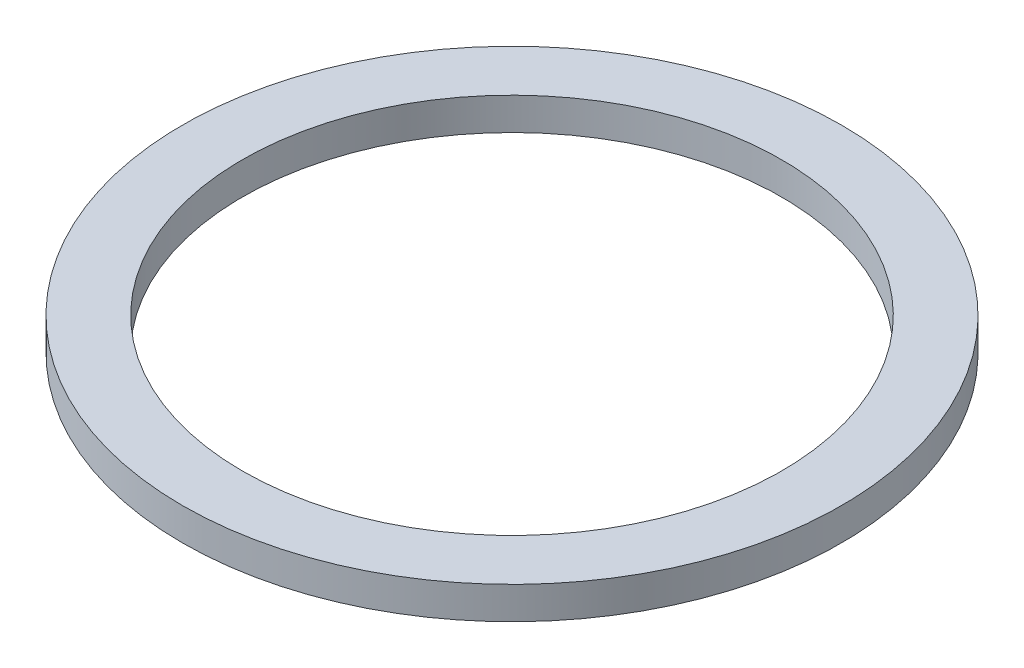
ISO-10303-21;
HEADER;
FILE_DESCRIPTION(('STEP AP214'),'2;1');
FILE_NAME('part.step','',(''),(''),'','','');
FILE_SCHEMA(('AUTOMOTIVE_DESIGN { 1 0 10303 214 1 1 1 1 }'));
ENDSEC;
DATA;
#1=APPLICATION_CONTEXT('core data for automotive mechanical design processes');
#2=APPLICATION_PROTOCOL_DEFINITION('international standard','automotive_design',2000,#1);
#3=PRODUCT_CONTEXT('',#1,'mechanical');
#4=PRODUCT('Part','Part','',(#3));
#5=PRODUCT_RELATED_PRODUCT_CATEGORY('part','',(#4));
#6=PRODUCT_DEFINITION_FORMATION('','',#4);
#7=PRODUCT_DEFINITION_CONTEXT('part definition',#1,'design');
#8=PRODUCT_DEFINITION('design','',#6,#7);
#9=PRODUCT_DEFINITION_SHAPE('','',#8);
#10=(LENGTH_UNIT() NAMED_UNIT(*) SI_UNIT(.MILLI.,.METRE.));
#11=(NAMED_UNIT(*) PLANE_ANGLE_UNIT() SI_UNIT($,.RADIAN.));
#12=(NAMED_UNIT(*) SI_UNIT($,.STERADIAN.) SOLID_ANGLE_UNIT());
#13=UNCERTAINTY_MEASURE_WITH_UNIT(LENGTH_MEASURE(1.E-05),#10,'distance_accuracy_value','');
#14=(GEOMETRIC_REPRESENTATION_CONTEXT(3) GLOBAL_UNCERTAINTY_ASSIGNED_CONTEXT((#13)) GLOBAL_UNIT_ASSIGNED_CONTEXT((#10,
#11,#12)) REPRESENTATION_CONTEXT('',''));
#15=CARTESIAN_POINT('',(0.,0.,0.));
#16=DIRECTION('',(0.,0.,1.));
#17=DIRECTION('',(1.,0.,0.));
#18=AXIS2_PLACEMENT_3D('',#15,#16,#17);
#19=CARTESIAN_POINT('',(0.,1.62,0.));
#20=DIRECTION('',(0.,-1.,0.));
#21=DIRECTION('',(0.,0.,-1.));
#22=AXIS2_PLACEMENT_3D('',#19,#20,#21);
#23=CYLINDRICAL_SURFACE('',#22,16.5);
#24=CARTESIAN_POINT('',(0.,1.62,0.));
#25=DIRECTION('',(0.,1.,0.));
#26=DIRECTION('',(0.,0.,1.));
#27=AXIS2_PLACEMENT_3D('',#24,#25,#26);
#28=CIRCLE('',#27,16.5);
#29=CARTESIAN_POINT('',(0.,1.62,16.5));
#30=VERTEX_POINT('',#29);
#31=EDGE_CURVE('E10',#30,#30,#28,.T.);
#32=ORIENTED_EDGE('',*,*,#31,.F.);
#33=EDGE_LOOP('',(#32));
#34=FACE_BOUND('',#33,.T.);
#35=CARTESIAN_POINT('',(0.,0.,0.));
#36=DIRECTION('',(0.,1.,0.));
#37=DIRECTION('',(0.,0.,1.));
#38=AXIS2_PLACEMENT_3D('',#35,#36,#37);
#39=CIRCLE('',#38,16.5);
#40=CARTESIAN_POINT('',(0.,0.,16.5));
#41=VERTEX_POINT('',#40);
#42=EDGE_CURVE('E33',#41,#41,#39,.T.);
#43=ORIENTED_EDGE('',*,*,#42,.T.);
#44=EDGE_LOOP('',(#43));
#45=FACE_BOUND('',#44,.T.);
#46=ADVANCED_FACE('F30',(#34,#45),#23,.T.);
#47=CARTESIAN_POINT('',(0.,1.62,0.));
#48=DIRECTION('',(0.,1.,0.));
#49=DIRECTION('',(0.,0.,1.));
#50=AXIS2_PLACEMENT_3D('',#47,#48,#49);
#51=PLANE('',#50);
#52=CARTESIAN_POINT('',(0.,1.62,0.));
#53=DIRECTION('',(0.,1.,0.));
#54=DIRECTION('',(0.,0.,1.));
#55=AXIS2_PLACEMENT_3D('',#52,#53,#54);
#56=CIRCLE('',#55,13.5);
#57=CARTESIAN_POINT('',(0.,1.62,13.5));
#58=VERTEX_POINT('',#57);
#59=EDGE_CURVE('E42',#58,#58,#56,.T.);
#60=ORIENTED_EDGE('',*,*,#59,.F.);
#61=EDGE_LOOP('',(#60));
#62=FACE_BOUND('',#61,.T.);
#63=ORIENTED_EDGE('',*,*,#31,.T.);
#64=EDGE_LOOP('',(#63));
#65=FACE_BOUND('',#64,.T.);
#66=ADVANCED_FACE('F57',(#62,#65),#51,.T.);
#67=CARTESIAN_POINT('',(0.,0.,0.));
#68=DIRECTION('',(0.,1.,0.));
#69=DIRECTION('',(0.,0.,1.));
#70=AXIS2_PLACEMENT_3D('',#67,#68,#69);
#71=PLANE('',#70);
#72=CARTESIAN_POINT('',(0.,0.,0.));
#73=DIRECTION('',(0.,1.,0.));
#74=DIRECTION('',(0.,0.,1.));
#75=AXIS2_PLACEMENT_3D('',#72,#73,#74);
#76=CIRCLE('',#75,13.5);
#77=CARTESIAN_POINT('',(0.,0.,13.5));
#78=VERTEX_POINT('',#77);
#79=EDGE_CURVE('E40',#78,#78,#76,.T.);
#80=ORIENTED_EDGE('',*,*,#79,.T.);
#81=EDGE_LOOP('',(#80));
#82=FACE_BOUND('',#81,.T.);
#83=ORIENTED_EDGE('',*,*,#42,.F.);
#84=EDGE_LOOP('',(#83));
#85=FACE_BOUND('',#84,.T.);
#86=ADVANCED_FACE('F48',(#82,#85),#71,.F.);
#87=CARTESIAN_POINT('',(0.,0.,0.));
#88=DIRECTION('',(0.,1.,0.));
#89=DIRECTION('',(0.,0.,1.));
#90=AXIS2_PLACEMENT_3D('',#87,#88,#89);
#91=CYLINDRICAL_SURFACE('',#90,13.5);
#92=ORIENTED_EDGE('',*,*,#79,.F.);
#93=EDGE_LOOP('',(#92));
#94=FACE_BOUND('',#93,.T.);
#95=ORIENTED_EDGE('',*,*,#59,.T.);
#96=EDGE_LOOP('',(#95));
#97=FACE_BOUND('',#96,.T.);
#98=ADVANCED_FACE('F51',(#94,#97),#91,.F.);
#99=CLOSED_SHELL('',(#46,#66,#86,#98));
#100=MANIFOLD_SOLID_BREP('B2',#99);
#101=ADVANCED_BREP_SHAPE_REPRESENTATION('',(#18,#100),#14);
#102=SHAPE_DEFINITION_REPRESENTATION(#9,#101);
ENDSEC;
END-ISO-10303-21;
